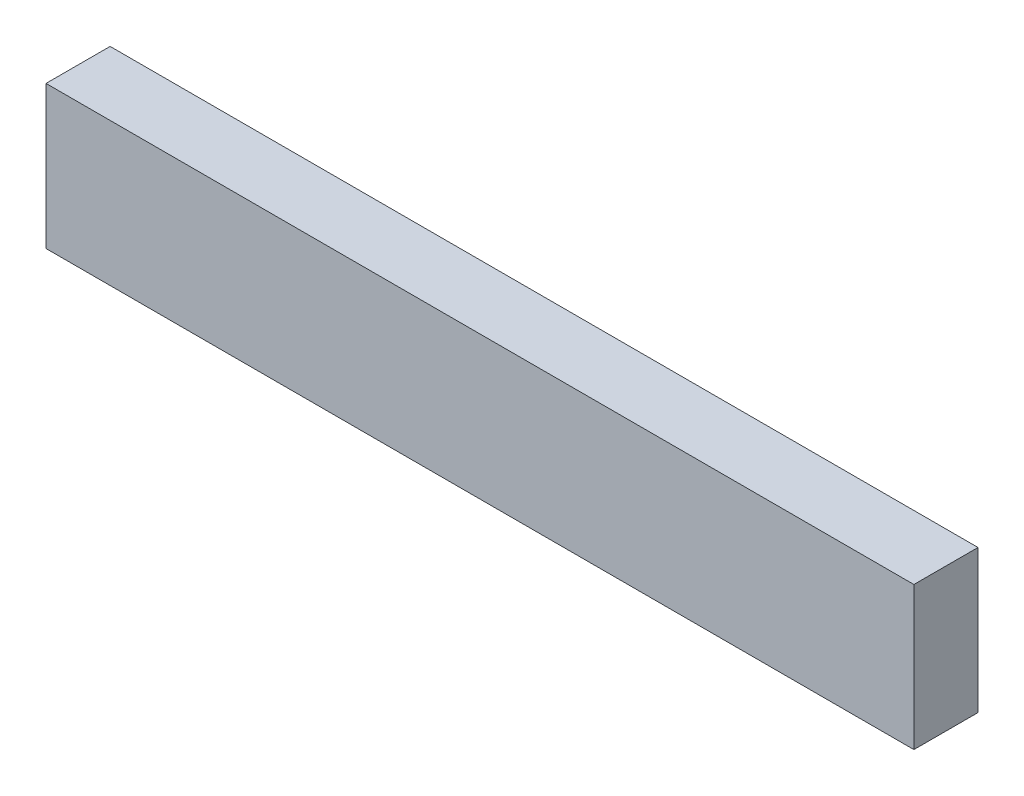
ISO-10303-21;
HEADER;
FILE_DESCRIPTION(('STEP AP214'),'2;1');
FILE_NAME('part.step','',(''),(''),'','','');
FILE_SCHEMA(('AUTOMOTIVE_DESIGN { 1 0 10303 214 1 1 1 1 }'));
ENDSEC;
DATA;
#1=APPLICATION_CONTEXT('core data for automotive mechanical design processes');
#2=APPLICATION_PROTOCOL_DEFINITION('international standard','automotive_design',2000,#1);
#3=PRODUCT_CONTEXT('',#1,'mechanical');
#4=PRODUCT('Part','Part','',(#3));
#5=PRODUCT_RELATED_PRODUCT_CATEGORY('part','',(#4));
#6=PRODUCT_DEFINITION_FORMATION('','',#4);
#7=PRODUCT_DEFINITION_CONTEXT('part definition',#1,'design');
#8=PRODUCT_DEFINITION('design','',#6,#7);
#9=PRODUCT_DEFINITION_SHAPE('','',#8);
#10=(LENGTH_UNIT() NAMED_UNIT(*) SI_UNIT(.MILLI.,.METRE.));
#11=(NAMED_UNIT(*) PLANE_ANGLE_UNIT() SI_UNIT($,.RADIAN.));
#12=(NAMED_UNIT(*) SI_UNIT($,.STERADIAN.) SOLID_ANGLE_UNIT());
#13=UNCERTAINTY_MEASURE_WITH_UNIT(LENGTH_MEASURE(1.E-05),#10,'distance_accuracy_value','');
#14=(GEOMETRIC_REPRESENTATION_CONTEXT(3) GLOBAL_UNCERTAINTY_ASSIGNED_CONTEXT((#13)) GLOBAL_UNIT_ASSIGNED_CONTEXT((#10,
#11,#12)) REPRESENTATION_CONTEXT('',''));
#15=CARTESIAN_POINT('',(0.,0.,0.));
#16=DIRECTION('',(0.,0.,1.));
#17=DIRECTION('',(1.,0.,0.));
#18=AXIS2_PLACEMENT_3D('',#15,#16,#17);
#19=CARTESIAN_POINT('',(0.,11.049,0.));
#20=DIRECTION('',(1.,0.,0.));
#21=DIRECTION('',(0.,0.,-1.));
#22=AXIS2_PLACEMENT_3D('',#19,#20,#21);
#23=PLANE('',#22);
#24=DIRECTION('',(0.,0.,1.));
#25=VECTOR('',#24,1.);
#26=CARTESIAN_POINT('',(0.,0.,0.));
#27=LINE('',#26,#25);
#28=CARTESIAN_POINT('',(0.,0.,-4.953));
#29=VERTEX_POINT('',#28);
#30=CARTESIAN_POINT('',(0.,0.,0.));
#31=VERTEX_POINT('',#30);
#32=EDGE_CURVE('E97',#29,#31,#27,.T.);
#33=ORIENTED_EDGE('',*,*,#32,.T.);
#34=DIRECTION('',(0.,-1.,0.));
#35=VECTOR('',#34,1.);
#36=CARTESIAN_POINT('',(0.,11.049,0.));
#37=LINE('',#36,#35);
#38=CARTESIAN_POINT('',(0.,11.049,0.));
#39=VERTEX_POINT('',#38);
#40=EDGE_CURVE('E11',#39,#31,#37,.T.);
#41=ORIENTED_EDGE('',*,*,#40,.F.);
#42=DIRECTION('',(0.,0.,1.));
#43=VECTOR('',#42,1.);
#44=CARTESIAN_POINT('',(0.,11.049,0.));
#45=LINE('',#44,#43);
#46=CARTESIAN_POINT('',(0.,11.049,-4.953));
#47=VERTEX_POINT('',#46);
#48=EDGE_CURVE('E85',#47,#39,#45,.T.);
#49=ORIENTED_EDGE('',*,*,#48,.F.);
#50=DIRECTION('',(0.,-1.,0.));
#51=VECTOR('',#50,1.);
#52=CARTESIAN_POINT('',(0.,11.049,-4.953));
#53=LINE('',#52,#51);
#54=EDGE_CURVE('E93',#47,#29,#53,.T.);
#55=ORIENTED_EDGE('',*,*,#54,.T.);
#56=EDGE_LOOP('',(#33,#41,#49,#55));
#57=FACE_BOUND('',#56,.T.);
#58=ADVANCED_FACE('F34',(#57),#23,.F.);
#59=CARTESIAN_POINT('',(0.,11.049,0.));
#60=DIRECTION('',(0.,0.,-1.));
#61=DIRECTION('',(-1.,0.,0.));
#62=AXIS2_PLACEMENT_3D('',#59,#60,#61);
#63=PLANE('',#62);
#64=DIRECTION('',(1.,0.,0.));
#65=VECTOR('',#64,1.);
#66=CARTESIAN_POINT('',(0.,0.,0.));
#67=LINE('',#66,#65);
#68=CARTESIAN_POINT('',(67.056,0.,0.));
#69=VERTEX_POINT('',#68);
#70=EDGE_CURVE('E89',#31,#69,#67,.T.);
#71=ORIENTED_EDGE('',*,*,#70,.T.);
#72=DIRECTION('',(0.,-1.,0.));
#73=VECTOR('',#72,1.);
#74=CARTESIAN_POINT('',(67.056,11.049,0.));
#75=LINE('',#74,#73);
#76=CARTESIAN_POINT('',(67.056,11.049,0.));
#77=VERTEX_POINT('',#76);
#78=EDGE_CURVE('E42',#77,#69,#75,.T.);
#79=ORIENTED_EDGE('',*,*,#78,.F.);
#80=DIRECTION('',(1.,0.,0.));
#81=VECTOR('',#80,1.);
#82=CARTESIAN_POINT('',(0.,11.049,0.));
#83=LINE('',#82,#81);
#84=EDGE_CURVE('E80',#39,#77,#83,.T.);
#85=ORIENTED_EDGE('',*,*,#84,.F.);
#86=ORIENTED_EDGE('',*,*,#40,.T.);
#87=EDGE_LOOP('',(#71,#79,#85,#86));
#88=FACE_BOUND('',#87,.T.);
#89=ADVANCED_FACE('F88',(#88),#63,.F.);
#90=CARTESIAN_POINT('',(67.056,11.049,0.));
#91=DIRECTION('',(-1.,0.,0.));
#92=DIRECTION('',(0.,0.,1.));
#93=AXIS2_PLACEMENT_3D('',#90,#91,#92);
#94=PLANE('',#93);
#95=DIRECTION('',(0.,0.,-1.));
#96=VECTOR('',#95,1.);
#97=CARTESIAN_POINT('',(67.056,0.,0.));
#98=LINE('',#97,#96);
#99=CARTESIAN_POINT('',(67.056,0.,-4.953));
#100=VERTEX_POINT('',#99);
#101=EDGE_CURVE('E67',#69,#100,#98,.T.);
#102=ORIENTED_EDGE('',*,*,#101,.T.);
#103=DIRECTION('',(0.,-1.,0.));
#104=VECTOR('',#103,1.);
#105=CARTESIAN_POINT('',(67.056,11.049,-4.953));
#106=LINE('',#105,#104);
#107=CARTESIAN_POINT('',(67.056,11.049,-4.953));
#108=VERTEX_POINT('',#107);
#109=EDGE_CURVE('E90',#108,#100,#106,.T.);
#110=ORIENTED_EDGE('',*,*,#109,.F.);
#111=DIRECTION('',(0.,0.,-1.));
#112=VECTOR('',#111,1.);
#113=CARTESIAN_POINT('',(67.056,11.049,0.));
#114=LINE('',#113,#112);
#115=EDGE_CURVE('E83',#77,#108,#114,.T.);
#116=ORIENTED_EDGE('',*,*,#115,.F.);
#117=ORIENTED_EDGE('',*,*,#78,.T.);
#118=EDGE_LOOP('',(#102,#110,#116,#117));
#119=FACE_BOUND('',#118,.T.);
#120=ADVANCED_FACE('F91',(#119),#94,.F.);
#121=CARTESIAN_POINT('',(0.,11.049,-4.953));
#122=DIRECTION('',(0.,0.,1.));
#123=DIRECTION('',(1.,0.,0.));
#124=AXIS2_PLACEMENT_3D('',#121,#122,#123);
#125=PLANE('',#124);
#126=DIRECTION('',(-1.,0.,0.));
#127=VECTOR('',#126,1.);
#128=CARTESIAN_POINT('',(0.,0.,-4.953));
#129=LINE('',#128,#127);
#130=EDGE_CURVE('E73',#100,#29,#129,.T.);
#131=ORIENTED_EDGE('',*,*,#130,.T.);
#132=ORIENTED_EDGE('',*,*,#54,.F.);
#133=DIRECTION('',(-1.,0.,0.));
#134=VECTOR('',#133,1.);
#135=CARTESIAN_POINT('',(0.,11.049,-4.953));
#136=LINE('',#135,#134);
#137=EDGE_CURVE('E50',#108,#47,#136,.T.);
#138=ORIENTED_EDGE('',*,*,#137,.F.);
#139=ORIENTED_EDGE('',*,*,#109,.T.);
#140=EDGE_LOOP('',(#131,#132,#138,#139));
#141=FACE_BOUND('',#140,.T.);
#142=ADVANCED_FACE('F104',(#141),#125,.F.);
#143=CARTESIAN_POINT('',(0.,11.049,0.));
#144=DIRECTION('',(0.,-1.,0.));
#145=DIRECTION('',(0.,0.,-1.));
#146=AXIS2_PLACEMENT_3D('',#143,#144,#145);
#147=PLANE('',#146);
#148=ORIENTED_EDGE('',*,*,#48,.T.);
#149=ORIENTED_EDGE('',*,*,#84,.T.);
#150=ORIENTED_EDGE('',*,*,#115,.T.);
#151=ORIENTED_EDGE('',*,*,#137,.T.);
#152=EDGE_LOOP('',(#148,#149,#150,#151));
#153=FACE_BOUND('',#152,.T.);
#154=ADVANCED_FACE('F81',(#153),#147,.F.);
#155=CARTESIAN_POINT('',(0.,0.,0.));
#156=DIRECTION('',(0.,-1.,0.));
#157=DIRECTION('',(0.,0.,-1.));
#158=AXIS2_PLACEMENT_3D('',#155,#156,#157);
#159=PLANE('',#158);
#160=ORIENTED_EDGE('',*,*,#32,.F.);
#161=ORIENTED_EDGE('',*,*,#130,.F.);
#162=ORIENTED_EDGE('',*,*,#101,.F.);
#163=ORIENTED_EDGE('',*,*,#70,.F.);
#164=EDGE_LOOP('',(#160,#161,#162,#163));
#165=FACE_BOUND('',#164,.T.);
#166=ADVANCED_FACE('F107',(#165),#159,.T.);
#167=CLOSED_SHELL('',(#58,#89,#120,#142,#154,#166));
#168=MANIFOLD_SOLID_BREP('B2',#167);
#169=ADVANCED_BREP_SHAPE_REPRESENTATION('',(#18,#168),#14);
#170=SHAPE_DEFINITION_REPRESENTATION(#9,#169);
ENDSEC;
END-ISO-10303-21;
